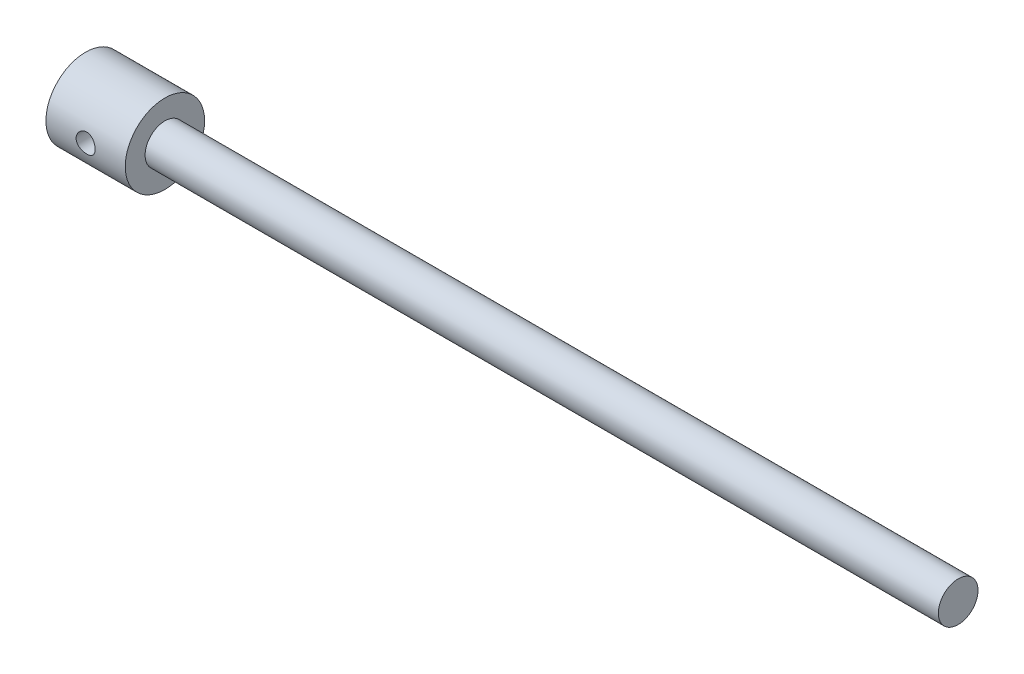
ISO-10303-21;
HEADER;
FILE_DESCRIPTION(('STEP AP214'),'2;1');
FILE_NAME('part.step','',(''),(''),'','','');
FILE_SCHEMA(('AUTOMOTIVE_DESIGN { 1 0 10303 214 1 1 1 1 }'));
ENDSEC;
DATA;
#1=APPLICATION_CONTEXT('core data for automotive mechanical design processes');
#2=APPLICATION_PROTOCOL_DEFINITION('international standard','automotive_design',2000,#1);
#3=PRODUCT_CONTEXT('',#1,'mechanical');
#4=PRODUCT('Part','Part','',(#3));
#5=PRODUCT_RELATED_PRODUCT_CATEGORY('part','',(#4));
#6=PRODUCT_DEFINITION_FORMATION('','',#4);
#7=PRODUCT_DEFINITION_CONTEXT('part definition',#1,'design');
#8=PRODUCT_DEFINITION('design','',#6,#7);
#9=PRODUCT_DEFINITION_SHAPE('','',#8);
#10=(LENGTH_UNIT() NAMED_UNIT(*) SI_UNIT(.MILLI.,.METRE.));
#11=(NAMED_UNIT(*) PLANE_ANGLE_UNIT() SI_UNIT($,.RADIAN.));
#12=(NAMED_UNIT(*) SI_UNIT($,.STERADIAN.) SOLID_ANGLE_UNIT());
#13=UNCERTAINTY_MEASURE_WITH_UNIT(LENGTH_MEASURE(1.E-05),#10,'distance_accuracy_value','');
#14=(GEOMETRIC_REPRESENTATION_CONTEXT(3) GLOBAL_UNCERTAINTY_ASSIGNED_CONTEXT((#13)) GLOBAL_UNIT_ASSIGNED_CONTEXT((#10,
#11,#12)) REPRESENTATION_CONTEXT('',''));
#15=CARTESIAN_POINT('',(0.,0.,0.));
#16=DIRECTION('',(0.,0.,1.));
#17=DIRECTION('',(1.,0.,0.));
#18=AXIS2_PLACEMENT_3D('',#15,#16,#17);
#19=CARTESIAN_POINT('',(50.,0.,0.));
#20=DIRECTION('',(-1.,0.,0.));
#21=DIRECTION('',(0.,0.,1.));
#22=AXIS2_PLACEMENT_3D('',#19,#20,#21);
#23=CYLINDRICAL_SURFACE('',#22,25.);
#24=CARTESIAN_POINT('',(31.,0.,25.));
#25=CARTESIAN_POINT('',(31.0000045654021,-0.166017736340745,25.0000026804997));
#26=CARTESIAN_POINT('',(30.9931083315099,-0.331984064130571,24.9983437383731));
#27=CARTESIAN_POINT('',(30.9655909900526,-0.662757375273785,24.9917601768854));
#28=CARTESIAN_POINT('',(30.9449681517169,-0.827564209779564,24.9868351457074));
#29=CARTESIAN_POINT('',(30.8901535848326,-1.15483168687375,24.9738504635424));
#30=CARTESIAN_POINT('',(30.855957043403,-1.31729147606247,24.9657897007271));
#31=CARTESIAN_POINT('',(30.7742619207701,-1.63872050759381,24.9467537443302));
#32=CARTESIAN_POINT('',(30.7267584397992,-1.79768844089951,24.9357774773038));
#33=CARTESIAN_POINT('',(30.6189154000372,-2.11072366381165,24.9112316091515));
#34=CARTESIAN_POINT('',(30.5585957367627,-2.26479812859838,24.897666030887));
#35=CARTESIAN_POINT('',(30.4255126504005,-2.56731972417304,24.8682925860487));
#36=CARTESIAN_POINT('',(30.3527446342751,-2.71576475309531,24.8524838922068));
#37=CARTESIAN_POINT('',(30.1953429094483,-3.00593509691774,24.8190587739081));
#38=CARTESIAN_POINT('',(30.1107137253609,-3.14766294672406,24.8014430394569));
#39=CARTESIAN_POINT('',(29.930128760191,-3.42359889441685,24.7648612187919));
#40=CARTESIAN_POINT('',(29.8341687278593,-3.55780414185136,24.7458946268123));
#41=CARTESIAN_POINT('',(29.6298945004368,-3.81996752921303,24.7067947855154));
#42=CARTESIAN_POINT('',(29.5214001376863,-3.94778319107671,24.6866473068088));
#43=CARTESIAN_POINT('',(29.2940876458784,-4.19391043753479,24.6460277155742));
#44=CARTESIAN_POINT('',(29.1752657022346,-4.31221847908383,24.6255554853983));
#45=CARTESIAN_POINT('',(28.9281491358483,-4.53846894982133,24.5848634527513));
#46=CARTESIAN_POINT('',(28.7998569991231,-4.64641408237687,24.5646435856504));
#47=CARTESIAN_POINT('',(28.5345631328875,-4.85128465634762,24.5250062264423));
#48=CARTESIAN_POINT('',(28.3975582064557,-4.94820601608992,24.5055890332168));
#49=CARTESIAN_POINT('',(28.1139109412451,-5.1315149308875,24.4678652790419));
#50=CARTESIAN_POINT('',(27.9671650785524,-5.21774615640803,24.4495768107614));
#51=CARTESIAN_POINT('',(27.6666458172853,-5.37754406139993,24.4149279468241));
#52=CARTESIAN_POINT('',(27.5128697930405,-5.45110595933349,24.3985682798489));
#53=CARTESIAN_POINT('',(27.1994677660297,-5.58492026214268,24.3682865029779));
#54=CARTESIAN_POINT('',(27.0398446450393,-5.64517912327471,24.354363211339));
#55=CARTESIAN_POINT('',(26.7158528745254,-5.75195806967358,24.3293636773731));
#56=CARTESIAN_POINT('',(26.5514825437586,-5.79847322039682,24.318288457803));
#57=CARTESIAN_POINT('',(26.0591991958386,-5.91523377010967,24.2902598679583));
#58=CARTESIAN_POINT('',(25.7258747491139,-5.96534620186162,24.2778811042379));
#59=CARTESIAN_POINT('',(25.2235243982438,-5.99819895021148,24.2697663322526));
#60=CARTESIAN_POINT('',(25.055614512631,-6.00209048242323,24.2688053008257));
#61=CARTESIAN_POINT('',(24.7200533387406,-5.99581246294926,24.2703574949624));
#62=CARTESIAN_POINT('',(24.5524020533586,-5.98564275494965,24.2728707591485));
#63=CARTESIAN_POINT('',(24.0592354379643,-5.93483975630032,24.285368999466));
#64=CARTESIAN_POINT('',(23.7356610926301,-5.87440247397773,24.3001939850224));
#65=CARTESIAN_POINT('',(23.1035551402389,-5.70184242669471,24.3412549446464));
#66=CARTESIAN_POINT('',(22.7950245310886,-5.58971623816142,24.3674916745551));
#67=CARTESIAN_POINT('',(22.1981876883057,-5.3158825349441,24.4286958367201));
#68=CARTESIAN_POINT('',(21.9100987536133,-5.15371899452584,24.4637429965247));
#69=CARTESIAN_POINT('',(21.3647873385141,-4.78473374953621,24.5385748778448));
#70=CARTESIAN_POINT('',(21.1075698769834,-4.57790479882186,24.5783603675971));
#71=CARTESIAN_POINT('',(20.6242138778088,-4.11902988641842,24.6594640880418));
#72=CARTESIAN_POINT('',(20.3990660746999,-3.86594129003371,24.7007951674045));
#73=CARTESIAN_POINT('',(19.9942302876759,-3.32511184695823,24.7793903091839));
#74=CARTESIAN_POINT('',(19.8145434865743,-3.03737009894219,24.8166542657671));
#75=CARTESIAN_POINT('',(19.5054056318309,-2.43405695507431,24.8830789940348));
#76=CARTESIAN_POINT('',(19.3761051057317,-2.11840557448716,24.9122154123614));
#77=CARTESIAN_POINT('',(19.1726698236987,-1.46899521159138,24.9589240940734));
#78=CARTESIAN_POINT('',(19.0985253649671,-1.13523942521409,24.9764983913503));
#79=CARTESIAN_POINT('',(19.0089958704804,-0.467574800827575,24.9978055089126));
#80=CARTESIAN_POINT('',(18.9922601968733,-0.133856966575296,25.0018564268946));
#81=CARTESIAN_POINT('',(19.0143335519038,0.531608768658087,24.9965614831509));
#82=CARTESIAN_POINT('',(19.053137996564,0.863356829944318,24.9872167270307));
#83=CARTESIAN_POINT('',(19.1840738854237,1.51084514007902,24.9563832816127));
#84=CARTESIAN_POINT('',(19.2754779523593,1.8267410839496,24.9350603275565));
#85=CARTESIAN_POINT('',(19.5081966502045,2.4387066749497,24.8826669936479));
#86=CARTESIAN_POINT('',(19.6495160816406,2.73477441187555,24.8515956762951));
#87=CARTESIAN_POINT('',(19.9807321749523,3.30412273668564,24.7823820658762));
#88=CARTESIAN_POINT('',(20.171397626969,3.57694246966835,24.7441307708391));
#89=CARTESIAN_POINT('',(20.5949176655097,4.08719914724013,24.6649871461435));
#90=CARTESIAN_POINT('',(20.8277789307352,4.32463047973872,24.6240943990595));
#91=CARTESIAN_POINT('',(21.3352671241418,4.76284500809665,24.5431489449983));
#92=CARTESIAN_POINT('',(21.6107154179113,4.96268414096836,24.5031358001301));
#93=CARTESIAN_POINT('',(22.1922356795911,5.31333575577366,24.4295058119813));
#94=CARTESIAN_POINT('',(22.4983062754937,5.46415043292341,24.395888682328));
#95=CARTESIAN_POINT('',(22.9725936839859,5.64963439053451,24.353347630646));
#96=CARTESIAN_POINT('',(23.1328069566145,5.70458710242878,24.3405033891164));
#97=CARTESIAN_POINT('',(23.457482020032,5.80079732294278,24.3177552029261));
#98=CARTESIAN_POINT('',(23.6219421871433,5.84205998439171,24.3078501521252));
#99=CARTESIAN_POINT('',(23.9539179032292,5.91053741786634,24.2912903166139));
#100=CARTESIAN_POINT('',(24.1214335511052,5.93775173433045,24.2846356373073));
#101=CARTESIAN_POINT('',(24.4582664668551,5.97789965204539,24.2747841701866));
#102=CARTESIAN_POINT('',(24.6275836538608,5.99083389159895,24.2715872278157));
#103=CARTESIAN_POINT('',(24.9622487305118,6.00215499594078,24.2687899616173));
#104=CARTESIAN_POINT('',(25.1275832844736,6.00091722515411,24.2690968340135));
#105=CARTESIAN_POINT('',(25.4575435219348,5.98480872784869,24.2730742483489));
#106=CARTESIAN_POINT('',(25.6221692208079,5.969938298505,24.2767447169658));
#107=CARTESIAN_POINT('',(25.9495546015662,5.92668661056588,24.2873399112073));
#108=CARTESIAN_POINT('',(26.1123139864983,5.89830323162515,24.294265147542));
#109=CARTESIAN_POINT('',(26.4347302014815,5.82827196779404,24.3111608262961));
#110=CARTESIAN_POINT('',(26.59438810625,5.78662876790753,24.3211301931022));
#111=CARTESIAN_POINT('',(26.9088075189712,5.69063662986335,24.3437686465433));
#112=CARTESIAN_POINT('',(27.0635886271826,5.63634876916799,24.3564247302984));
#113=CARTESIAN_POINT('',(27.3679533881392,5.51539707483437,24.3840980883562));
#114=CARTESIAN_POINT('',(27.5175388295994,5.44873755154826,24.3991145400161));
#115=CARTESIAN_POINT('',(27.8106621669156,5.30348427217981,24.4310987091682));
#116=CARTESIAN_POINT('',(27.9541973483356,5.22488523075194,24.4480672900111));
#117=CARTESIAN_POINT('',(28.2341911451689,5.05635243091258,24.4834782828489));
#118=CARTESIAN_POINT('',(28.3706520835145,4.96642242689348,24.5019202059306));
#119=CARTESIAN_POINT('',(28.6389503832923,4.77346921711415,24.5402505889388));
#120=CARTESIAN_POINT('',(28.7705923311298,4.67017903544834,24.5601634300573));
#121=CARTESIAN_POINT('',(29.02470841849,4.45304880482869,24.600458146359));
#122=CARTESIAN_POINT('',(29.1471856811228,4.33921237965749,24.6208398586377));
#123=CARTESIAN_POINT('',(29.3822931129819,4.10164015488732,24.661530300392));
#124=CARTESIAN_POINT('',(29.4949174263774,3.97789855094999,24.6818389796797));
#125=CARTESIAN_POINT('',(29.7094481047576,3.7214296777047,24.7218081005976));
#126=CARTESIAN_POINT('',(29.8113583669331,3.58870570477298,24.7414687761375));
#127=CARTESIAN_POINT('',(30.0054239224954,3.31280088827595,24.7799327781137));
#128=CARTESIAN_POINT('',(30.0973872483625,3.16948213881108,24.7987162302532));
#129=CARTESIAN_POINT('',(30.2688530722884,2.87543817634771,24.8345280560803));
#130=CARTESIAN_POINT('',(30.3483601559727,2.72471571591035,24.8515570748485));
#131=CARTESIAN_POINT('',(30.4943122871475,2.41692354679156,24.883375777664));
#132=CARTESIAN_POINT('',(30.5607634733439,2.25985686316148,24.8981665133663));
#133=CARTESIAN_POINT('',(30.6801042720391,1.94048744711082,24.9250921884147));
#134=CARTESIAN_POINT('',(30.7329960562763,1.77818555787967,24.9372275530119));
#135=CARTESIAN_POINT('',(30.8520251734541,1.35190448336008,24.9647957983314));
#136=CARTESIAN_POINT('',(30.9074241484908,1.08469226075993,24.9779181465939));
#137=CARTESIAN_POINT('',(30.9814066442059,0.544940331071898,24.9955177731159));
#138=CARTESIAN_POINT('',(30.9999925091139,0.272400964328513,24.9999956018512));
#139=CARTESIAN_POINT('',(31.,0.,25.));
#140=B_SPLINE_CURVE_WITH_KNOTS('',3,(#24,#25,#26,#27,#28,#29,#30,#31,#32,#33,#34,#35,#36,#37,
#38,#39,#40,#41,#42,#43,#44,#45,#46,#47,#48,#49,#50,#51,#52,#53,#54,#55,#56,#57,#58,#59,#60,#61,
#62,#63,#64,#65,#66,#67,#68,#69,#70,#71,#72,#73,#74,#75,#76,#77,#78,#79,#80,#81,#82,#83,#84,#85,
#86,#87,#88,#89,#90,#91,#92,#93,#94,#95,#96,#97,#98,#99,#100,#101,#102,#103,#104,#105,#106,#107,
#108,#109,#110,#111,#112,#113,#114,#115,#116,#117,#118,#119,#120,#121,#122,#123,#124,#125,#126,
#127,#128,#129,#130,#131,#132,#133,#134,#135,#136,#137,#138,#139),.UNSPECIFIED.,.T.,.F.,(4,2,2,
2,2,2,2,2,2,2,2,2,2,2,2,2,2,2,2,2,2,2,2,2,2,2,2,2,2,2,2,2,2,2,2,2,2,2,2,2,2,2,2,2,2,2,2,2,2,2,2,
2,2,2,2,2,2,4),(0.,0.497813360100955,0.995689500769747,1.49374233325073,1.99197879609469,
2.4894473877073,2.98709992652941,3.48456314269129,3.98221359994714,4.48820831908741,
4.99439073274951,5.50044073797177,6.00667750796929,6.51961190143619,7.03273945954076,
7.54561743540079,8.05867933189507,9.06463756237654,9.56800871792682,10.0713854693234,
11.0548629550302,12.0384055899336,13.0311908061742,14.0241372047509,15.0430966233895,
16.0620825507942,17.0840897493149,18.1059171185591,19.1035329919673,20.1010665323702,
21.085126203147,22.069280539993,23.0698021185097,24.0704821968969,25.0936623603892,
26.1167967016263,26.6258643414059,27.1347401541084,27.6436324676663,28.1525020334114,
28.6479253897995,29.1433379468293,29.6388282657176,30.1341437102249,30.6271145113294,
31.1199138801486,31.6129320389053,32.105787268885,32.6107272666003,33.1154944014541,
33.6205595212516,34.1254402854413,34.6387770201076,35.1519243293048,35.6648297831432,
36.1776530362049,36.9945144051894,37.8113237554193),.UNSPECIFIED.);
#141=CARTESIAN_POINT('',(31.,0.,25.));
#142=VERTEX_POINT('',#141);
#143=EDGE_CURVE('E43',#142,#142,#140,.T.);
#144=ORIENTED_EDGE('',*,*,#143,.T.);
#145=EDGE_LOOP('',(#144));
#146=FACE_BOUND('',#145,.T.);
#147=CARTESIAN_POINT('',(31.,0.,-25.));
#148=CARTESIAN_POINT('',(31.0000045654021,0.166017736340745,-25.0000026804997));
#149=CARTESIAN_POINT('',(30.9931083315099,0.331984064130571,-24.9983437383731));
#150=CARTESIAN_POINT('',(30.9655909900526,0.662757375273785,-24.9917601768854));
#151=CARTESIAN_POINT('',(30.9449681517169,0.827564209779564,-24.9868351457074));
#152=CARTESIAN_POINT('',(30.8901535848326,1.15483168687375,-24.9738504635424));
#153=CARTESIAN_POINT('',(30.855957043403,1.31729147606247,-24.9657897007271));
#154=CARTESIAN_POINT('',(30.7742619207701,1.63872050759381,-24.9467537443302));
#155=CARTESIAN_POINT('',(30.7267584397992,1.79768844089951,-24.9357774773038));
#156=CARTESIAN_POINT('',(30.6189154000372,2.11072366381165,-24.9112316091515));
#157=CARTESIAN_POINT('',(30.5585957367627,2.26479812859838,-24.897666030887));
#158=CARTESIAN_POINT('',(30.4255126504005,2.56731972417304,-24.8682925860487));
#159=CARTESIAN_POINT('',(30.3527446342751,2.71576475309531,-24.8524838922068));
#160=CARTESIAN_POINT('',(30.1953429094483,3.00593509691774,-24.8190587739081));
#161=CARTESIAN_POINT('',(30.1107137253609,3.14766294672406,-24.8014430394569));
#162=CARTESIAN_POINT('',(29.930128760191,3.42359889441685,-24.7648612187919));
#163=CARTESIAN_POINT('',(29.8341687278593,3.55780414185136,-24.7458946268123));
#164=CARTESIAN_POINT('',(29.6298945004368,3.81996752921303,-24.7067947855154));
#165=CARTESIAN_POINT('',(29.5214001376863,3.94778319107671,-24.6866473068088));
#166=CARTESIAN_POINT('',(29.2940876458784,4.19391043753479,-24.6460277155742));
#167=CARTESIAN_POINT('',(29.1752657022346,4.31221847908383,-24.6255554853983));
#168=CARTESIAN_POINT('',(28.9281491358483,4.53846894982133,-24.5848634527513));
#169=CARTESIAN_POINT('',(28.7998569991231,4.64641408237687,-24.5646435856504));
#170=CARTESIAN_POINT('',(28.5345631328875,4.85128465634762,-24.5250062264423));
#171=CARTESIAN_POINT('',(28.3975582064557,4.94820601608992,-24.5055890332168));
#172=CARTESIAN_POINT('',(28.1139109412451,5.1315149308875,-24.4678652790419));
#173=CARTESIAN_POINT('',(27.9671650785524,5.21774615640803,-24.4495768107614));
#174=CARTESIAN_POINT('',(27.6666458172853,5.37754406139993,-24.4149279468241));
#175=CARTESIAN_POINT('',(27.5128697930405,5.45110595933349,-24.3985682798489));
#176=CARTESIAN_POINT('',(27.1994677660297,5.58492026214268,-24.3682865029779));
#177=CARTESIAN_POINT('',(27.0398446450393,5.64517912327471,-24.354363211339));
#178=CARTESIAN_POINT('',(26.7158528745254,5.75195806967358,-24.3293636773731));
#179=CARTESIAN_POINT('',(26.5514825437586,5.79847322039682,-24.318288457803));
#180=CARTESIAN_POINT('',(26.0591991958386,5.91523377010967,-24.2902598679583));
#181=CARTESIAN_POINT('',(25.7258747491139,5.96534620186162,-24.2778811042379));
#182=CARTESIAN_POINT('',(25.2235243982438,5.99819895021148,-24.2697663322526));
#183=CARTESIAN_POINT('',(25.055614512631,6.00209048242323,-24.2688053008257));
#184=CARTESIAN_POINT('',(24.7200533387406,5.99581246294926,-24.2703574949624));
#185=CARTESIAN_POINT('',(24.5524020533586,5.98564275494965,-24.2728707591485));
#186=CARTESIAN_POINT('',(24.0592354379643,5.93483975630032,-24.285368999466));
#187=CARTESIAN_POINT('',(23.7356610926301,5.87440247397773,-24.3001939850224));
#188=CARTESIAN_POINT('',(23.1035551402389,5.70184242669471,-24.3412549446464));
#189=CARTESIAN_POINT('',(22.7950245310886,5.58971623816142,-24.3674916745551));
#190=CARTESIAN_POINT('',(22.1981876883057,5.3158825349441,-24.4286958367201));
#191=CARTESIAN_POINT('',(21.9100987536133,5.15371899452584,-24.4637429965247));
#192=CARTESIAN_POINT('',(21.3647873385141,4.78473374953621,-24.5385748778448));
#193=CARTESIAN_POINT('',(21.1075698769834,4.57790479882186,-24.5783603675971));
#194=CARTESIAN_POINT('',(20.6242138778088,4.11902988641842,-24.6594640880418));
#195=CARTESIAN_POINT('',(20.3990660746999,3.86594129003371,-24.7007951674045));
#196=CARTESIAN_POINT('',(19.9942302876759,3.32511184695823,-24.7793903091839));
#197=CARTESIAN_POINT('',(19.8145434865743,3.03737009894219,-24.8166542657671));
#198=CARTESIAN_POINT('',(19.5054056318309,2.43405695507431,-24.8830789940348));
#199=CARTESIAN_POINT('',(19.3761051057317,2.11840557448716,-24.9122154123614));
#200=CARTESIAN_POINT('',(19.1726698236987,1.46899521159138,-24.9589240940734));
#201=CARTESIAN_POINT('',(19.0985253649671,1.13523942521409,-24.9764983913503));
#202=CARTESIAN_POINT('',(19.0089958704804,0.467574800827575,-24.9978055089126));
#203=CARTESIAN_POINT('',(18.9922601968733,0.133856966575296,-25.0018564268946));
#204=CARTESIAN_POINT('',(19.0143335519038,-0.531608768658087,-24.9965614831509));
#205=CARTESIAN_POINT('',(19.053137996564,-0.863356829944318,-24.9872167270307));
#206=CARTESIAN_POINT('',(19.1840738854237,-1.51084514007902,-24.9563832816127));
#207=CARTESIAN_POINT('',(19.2754779523593,-1.8267410839496,-24.9350603275565));
#208=CARTESIAN_POINT('',(19.5081966502045,-2.4387066749497,-24.8826669936479));
#209=CARTESIAN_POINT('',(19.6495160816406,-2.73477441187555,-24.8515956762951));
#210=CARTESIAN_POINT('',(19.9807321749523,-3.30412273668564,-24.7823820658762));
#211=CARTESIAN_POINT('',(20.171397626969,-3.57694246966835,-24.7441307708391));
#212=CARTESIAN_POINT('',(20.5949176655097,-4.08719914724013,-24.6649871461435));
#213=CARTESIAN_POINT('',(20.8277789307352,-4.32463047973872,-24.6240943990595));
#214=CARTESIAN_POINT('',(21.3352671241418,-4.76284500809665,-24.5431489449983));
#215=CARTESIAN_POINT('',(21.6107154179113,-4.96268414096836,-24.5031358001301));
#216=CARTESIAN_POINT('',(22.1922356795911,-5.31333575577366,-24.4295058119813));
#217=CARTESIAN_POINT('',(22.4983062754937,-5.46415043292341,-24.395888682328));
#218=CARTESIAN_POINT('',(22.9725936839859,-5.64963439053451,-24.353347630646));
#219=CARTESIAN_POINT('',(23.1328069566145,-5.70458710242878,-24.3405033891164));
#220=CARTESIAN_POINT('',(23.457482020032,-5.80079732294278,-24.3177552029261));
#221=CARTESIAN_POINT('',(23.6219421871433,-5.84205998439171,-24.3078501521252));
#222=CARTESIAN_POINT('',(23.9539179032292,-5.91053741786634,-24.2912903166139));
#223=CARTESIAN_POINT('',(24.1214335511052,-5.93775173433045,-24.2846356373073));
#224=CARTESIAN_POINT('',(24.4582664668551,-5.97789965204539,-24.2747841701866));
#225=CARTESIAN_POINT('',(24.6275836538608,-5.99083389159895,-24.2715872278157));
#226=CARTESIAN_POINT('',(24.9622487305118,-6.00215499594078,-24.2687899616173));
#227=CARTESIAN_POINT('',(25.1275832844736,-6.00091722515411,-24.2690968340135));
#228=CARTESIAN_POINT('',(25.4575435219348,-5.98480872784869,-24.2730742483489));
#229=CARTESIAN_POINT('',(25.6221692208079,-5.969938298505,-24.2767447169658));
#230=CARTESIAN_POINT('',(25.9495546015662,-5.92668661056588,-24.2873399112073));
#231=CARTESIAN_POINT('',(26.1123139864983,-5.89830323162515,-24.294265147542));
#232=CARTESIAN_POINT('',(26.4347302014815,-5.82827196779404,-24.3111608262961));
#233=CARTESIAN_POINT('',(26.59438810625,-5.78662876790753,-24.3211301931022));
#234=CARTESIAN_POINT('',(26.9088075189712,-5.69063662986335,-24.3437686465433));
#235=CARTESIAN_POINT('',(27.0635886271826,-5.63634876916799,-24.3564247302984));
#236=CARTESIAN_POINT('',(27.3679533881392,-5.51539707483437,-24.3840980883562));
#237=CARTESIAN_POINT('',(27.5175388295994,-5.44873755154826,-24.3991145400161));
#238=CARTESIAN_POINT('',(27.8106621669156,-5.30348427217981,-24.4310987091682));
#239=CARTESIAN_POINT('',(27.9541973483356,-5.22488523075194,-24.4480672900111));
#240=CARTESIAN_POINT('',(28.2341911451689,-5.05635243091258,-24.4834782828489));
#241=CARTESIAN_POINT('',(28.3706520835145,-4.96642242689348,-24.5019202059306));
#242=CARTESIAN_POINT('',(28.6389503832923,-4.77346921711415,-24.5402505889388));
#243=CARTESIAN_POINT('',(28.7705923311298,-4.67017903544834,-24.5601634300573));
#244=CARTESIAN_POINT('',(29.02470841849,-4.45304880482869,-24.600458146359));
#245=CARTESIAN_POINT('',(29.1471856811228,-4.33921237965749,-24.6208398586377));
#246=CARTESIAN_POINT('',(29.3822931129819,-4.10164015488732,-24.661530300392));
#247=CARTESIAN_POINT('',(29.4949174263774,-3.97789855094999,-24.6818389796797));
#248=CARTESIAN_POINT('',(29.7094481047576,-3.7214296777047,-24.7218081005976));
#249=CARTESIAN_POINT('',(29.8113583669331,-3.58870570477298,-24.7414687761375));
#250=CARTESIAN_POINT('',(30.0054239224954,-3.31280088827595,-24.7799327781137));
#251=CARTESIAN_POINT('',(30.0973872483625,-3.16948213881108,-24.7987162302532));
#252=CARTESIAN_POINT('',(30.2688530722884,-2.87543817634771,-24.8345280560803));
#253=CARTESIAN_POINT('',(30.3483601559727,-2.72471571591035,-24.8515570748485));
#254=CARTESIAN_POINT('',(30.4943122871475,-2.41692354679156,-24.883375777664));
#255=CARTESIAN_POINT('',(30.5607634733439,-2.25985686316148,-24.8981665133663));
#256=CARTESIAN_POINT('',(30.6801042720391,-1.94048744711082,-24.9250921884147));
#257=CARTESIAN_POINT('',(30.7329960562763,-1.77818555787967,-24.9372275530119));
#258=CARTESIAN_POINT('',(30.8520251734541,-1.35190448336008,-24.9647957983314));
#259=CARTESIAN_POINT('',(30.9074241484908,-1.08469226075993,-24.9779181465939));
#260=CARTESIAN_POINT('',(30.9814066442059,-0.544940331071898,-24.9955177731159));
#261=CARTESIAN_POINT('',(30.9999925091139,-0.272400964328513,-24.9999956018512));
#262=CARTESIAN_POINT('',(31.,0.,-25.));
#263=B_SPLINE_CURVE_WITH_KNOTS('',3,(#147,#148,#149,#150,#151,#152,#153,#154,#155,#156,#157,
#158,#159,#160,#161,#162,#163,#164,#165,#166,#167,#168,#169,#170,#171,#172,#173,#174,#175,#176,
#177,#178,#179,#180,#181,#182,#183,#184,#185,#186,#187,#188,#189,#190,#191,#192,#193,#194,#195,
#196,#197,#198,#199,#200,#201,#202,#203,#204,#205,#206,#207,#208,#209,#210,#211,#212,#213,#214,
#215,#216,#217,#218,#219,#220,#221,#222,#223,#224,#225,#226,#227,#228,#229,#230,#231,#232,#233,
#234,#235,#236,#237,#238,#239,#240,#241,#242,#243,#244,#245,#246,#247,#248,#249,#250,#251,#252,
#253,#254,#255,#256,#257,#258,#259,#260,#261,#262),.UNSPECIFIED.,.T.,.F.,(4,2,2,2,2,2,2,2,2,2,2,
2,2,2,2,2,2,2,2,2,2,2,2,2,2,2,2,2,2,2,2,2,2,2,2,2,2,2,2,2,2,2,2,2,2,2,2,2,2,2,2,2,2,2,2,2,2,4),
(0.,0.497813360100955,0.995689500769747,1.49374233325073,1.99197879609469,2.4894473877073,
2.98709992652941,3.48456314269129,3.98221359994714,4.48820831908741,4.99439073274951,
5.50044073797177,6.00667750796929,6.51961190143619,7.03273945954076,7.54561743540079,
8.05867933189507,9.06463756237654,9.56800871792682,10.0713854693234,11.0548629550302,
12.0384055899336,13.0311908061742,14.0241372047509,15.0430966233895,16.0620825507942,
17.0840897493149,18.1059171185591,19.1035329919673,20.1010665323702,21.085126203147,
22.069280539993,23.0698021185097,24.0704821968969,25.0936623603892,26.1167967016263,
26.6258643414059,27.1347401541084,27.6436324676663,28.1525020334114,28.6479253897995,
29.1433379468293,29.6388282657176,30.1341437102249,30.6271145113294,31.1199138801486,
31.6129320389053,32.105787268885,32.6107272666003,33.1154944014541,33.6205595212516,
34.1254402854413,34.6387770201076,35.1519243293048,35.6648297831432,36.1776530362049,
36.9945144051894,37.8113237554193),.UNSPECIFIED.);
#264=CARTESIAN_POINT('',(31.,0.,-25.));
#265=VERTEX_POINT('',#264);
#266=EDGE_CURVE('E62',#265,#265,#263,.T.);
#267=ORIENTED_EDGE('',*,*,#266,.T.);
#268=EDGE_LOOP('',(#267));
#269=FACE_BOUND('',#268,.T.);
#270=CARTESIAN_POINT('',(50.,0.,0.));
#271=DIRECTION('',(1.,0.,0.));
#272=DIRECTION('',(0.,0.,-1.));
#273=AXIS2_PLACEMENT_3D('',#270,#271,#272);
#274=CIRCLE('',#273,25.);
#275=CARTESIAN_POINT('',(50.,0.,-25.));
#276=VERTEX_POINT('',#275);
#277=EDGE_CURVE('E51',#276,#276,#274,.T.);
#278=ORIENTED_EDGE('',*,*,#277,.F.);
#279=EDGE_LOOP('',(#278));
#280=FACE_BOUND('',#279,.T.);
#281=CARTESIAN_POINT('',(0.,0.,0.));
#282=DIRECTION('',(1.,0.,0.));
#283=DIRECTION('',(0.,0.,-1.));
#284=AXIS2_PLACEMENT_3D('',#281,#282,#283);
#285=CIRCLE('',#284,25.);
#286=CARTESIAN_POINT('',(0.,0.,-25.));
#287=VERTEX_POINT('',#286);
#288=EDGE_CURVE('E56',#287,#287,#285,.T.);
#289=ORIENTED_EDGE('',*,*,#288,.T.);
#290=EDGE_LOOP('',(#289));
#291=FACE_BOUND('',#290,.T.);
#292=ADVANCED_FACE('F39',(#146,#269,#280,#291),#23,.T.);
#293=CARTESIAN_POINT('',(50.,0.,0.));
#294=DIRECTION('',(1.,0.,0.));
#295=DIRECTION('',(0.,0.,-1.));
#296=AXIS2_PLACEMENT_3D('',#293,#294,#295);
#297=PLANE('',#296);
#298=CARTESIAN_POINT('',(50.,0.,0.));
#299=DIRECTION('',(1.,0.,0.));
#300=DIRECTION('',(0.,0.,-1.));
#301=AXIS2_PLACEMENT_3D('',#298,#299,#300);
#302=CIRCLE('',#301,12.5);
#303=CARTESIAN_POINT('',(50.,0.,-12.5));
#304=VERTEX_POINT('',#303);
#305=EDGE_CURVE('E10',#304,#304,#302,.T.);
#306=ORIENTED_EDGE('',*,*,#305,.F.);
#307=EDGE_LOOP('',(#306));
#308=FACE_BOUND('',#307,.T.);
#309=ORIENTED_EDGE('',*,*,#277,.T.);
#310=EDGE_LOOP('',(#309));
#311=FACE_BOUND('',#310,.T.);
#312=ADVANCED_FACE('F76',(#308,#311),#297,.T.);
#313=CARTESIAN_POINT('',(0.,0.,0.));
#314=DIRECTION('',(1.,0.,0.));
#315=DIRECTION('',(0.,0.,-1.));
#316=AXIS2_PLACEMENT_3D('',#313,#314,#315);
#317=PLANE('',#316);
#318=ORIENTED_EDGE('',*,*,#288,.F.);
#319=EDGE_LOOP('',(#318));
#320=FACE_BOUND('',#319,.T.);
#321=ADVANCED_FACE('F73',(#320),#317,.F.);
#322=CARTESIAN_POINT('',(25.,0.,-35.));
#323=DIRECTION('',(0.,0.,1.));
#324=DIRECTION('',(1.,0.,0.));
#325=AXIS2_PLACEMENT_3D('',#322,#323,#324);
#326=CYLINDRICAL_SURFACE('',#325,6.);
#327=ORIENTED_EDGE('',*,*,#266,.F.);
#328=EDGE_LOOP('',(#327));
#329=FACE_BOUND('',#328,.T.);
#330=ORIENTED_EDGE('',*,*,#143,.F.);
#331=EDGE_LOOP('',(#330));
#332=FACE_BOUND('',#331,.T.);
#333=ADVANCED_FACE('F67',(#329,#332),#326,.F.);
#334=CARTESIAN_POINT('',(550.,0.,0.));
#335=DIRECTION('',(-1.,0.,0.));
#336=DIRECTION('',(0.,0.,1.));
#337=AXIS2_PLACEMENT_3D('',#334,#335,#336);
#338=CYLINDRICAL_SURFACE('',#337,12.5);
#339=CARTESIAN_POINT('',(550.,0.,0.));
#340=DIRECTION('',(1.,0.,0.));
#341=DIRECTION('',(0.,0.,-1.));
#342=AXIS2_PLACEMENT_3D('',#339,#340,#341);
#343=CIRCLE('',#342,12.5);
#344=CARTESIAN_POINT('',(550.,0.,-12.5));
#345=VERTEX_POINT('',#344);
#346=EDGE_CURVE('E59',#345,#345,#343,.T.);
#347=ORIENTED_EDGE('',*,*,#346,.F.);
#348=EDGE_LOOP('',(#347));
#349=FACE_BOUND('',#348,.T.);
#350=ORIENTED_EDGE('',*,*,#305,.T.);
#351=EDGE_LOOP('',(#350));
#352=FACE_BOUND('',#351,.T.);
#353=ADVANCED_FACE('F72',(#349,#352),#338,.T.);
#354=CARTESIAN_POINT('',(550.,0.,0.));
#355=DIRECTION('',(1.,0.,0.));
#356=DIRECTION('',(0.,0.,-1.));
#357=AXIS2_PLACEMENT_3D('',#354,#355,#356);
#358=PLANE('',#357);
#359=ORIENTED_EDGE('',*,*,#346,.T.);
#360=EDGE_LOOP('',(#359));
#361=FACE_BOUND('',#360,.T.);
#362=ADVANCED_FACE('F115',(#361),#358,.T.);
#363=CLOSED_SHELL('',(#292,#312,#321,#333,#353,#362));
#364=MANIFOLD_SOLID_BREP('B2',#363);
#365=ADVANCED_BREP_SHAPE_REPRESENTATION('',(#18,#364),#14);
#366=SHAPE_DEFINITION_REPRESENTATION(#9,#365);
ENDSEC;
END-ISO-10303-21;
